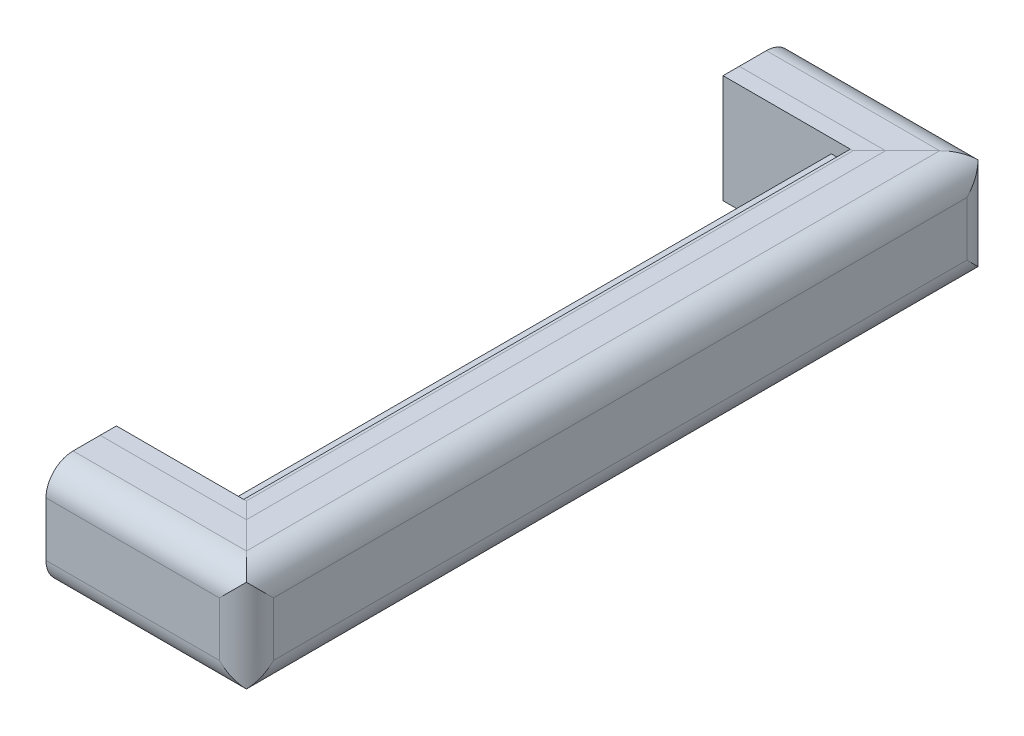
ISO-10303-21;
HEADER;
FILE_DESCRIPTION(('STEP AP214'),'2;1');
FILE_NAME('part.step','',(''),(''),'','','');
FILE_SCHEMA(('AUTOMOTIVE_DESIGN { 1 0 10303 214 1 1 1 1 }'));
ENDSEC;
DATA;
#1=APPLICATION_CONTEXT('core data for automotive mechanical design processes');
#2=APPLICATION_PROTOCOL_DEFINITION('international standard','automotive_design',2000,#1);
#3=PRODUCT_CONTEXT('',#1,'mechanical');
#4=PRODUCT('Part','Part','',(#3));
#5=PRODUCT_RELATED_PRODUCT_CATEGORY('part','',(#4));
#6=PRODUCT_DEFINITION_FORMATION('','',#4);
#7=PRODUCT_DEFINITION_CONTEXT('part definition',#1,'design');
#8=PRODUCT_DEFINITION('design','',#6,#7);
#9=PRODUCT_DEFINITION_SHAPE('','',#8);
#10=(LENGTH_UNIT() NAMED_UNIT(*) SI_UNIT(.MILLI.,.METRE.));
#11=(NAMED_UNIT(*) PLANE_ANGLE_UNIT() SI_UNIT($,.RADIAN.));
#12=(NAMED_UNIT(*) SI_UNIT($,.STERADIAN.) SOLID_ANGLE_UNIT());
#13=UNCERTAINTY_MEASURE_WITH_UNIT(LENGTH_MEASURE(1.E-05),#10,'distance_accuracy_value','');
#14=(GEOMETRIC_REPRESENTATION_CONTEXT(3) GLOBAL_UNCERTAINTY_ASSIGNED_CONTEXT((#13)) GLOBAL_UNIT_ASSIGNED_CONTEXT((#10,
#11,#12)) REPRESENTATION_CONTEXT('',''));
#15=CARTESIAN_POINT('',(0.,0.,0.));
#16=DIRECTION('',(0.,0.,1.));
#17=DIRECTION('',(1.,0.,0.));
#18=AXIS2_PLACEMENT_3D('',#15,#16,#17);
#19=CARTESIAN_POINT('',(149.225,0.,-387.35));
#20=DIRECTION('',(-1.,0.,0.));
#21=DIRECTION('',(0.,0.,1.));
#22=AXIS2_PLACEMENT_3D('',#19,#20,#21);
#23=PLANE('',#22);
#24=DIRECTION('',(0.,1.,0.));
#25=VECTOR('',#24,1.);
#26=CARTESIAN_POINT('',(149.225,0.,-355.6));
#27=LINE('',#26,#25);
#28=CARTESIAN_POINT('',(149.225,47.625,-355.6));
#29=VERTEX_POINT('',#28);
#30=CARTESIAN_POINT('',(149.225,63.5,-355.6));
#31=VERTEX_POINT('',#30);
#32=EDGE_CURVE('E55',#29,#31,#27,.T.);
#33=ORIENTED_EDGE('',*,*,#32,.F.);
#34=DIRECTION('',(0.,0.,1.));
#35=VECTOR('',#34,1.);
#36=CARTESIAN_POINT('',(149.225,47.625,-387.35));
#37=LINE('',#36,#35);
#38=CARTESIAN_POINT('',(149.225,47.625,355.6));
#39=VERTEX_POINT('',#38);
#40=EDGE_CURVE('E121',#29,#39,#37,.T.);
#41=ORIENTED_EDGE('',*,*,#40,.T.);
#42=DIRECTION('',(0.,-1.,0.));
#43=VECTOR('',#42,1.);
#44=CARTESIAN_POINT('',(149.225,0.,355.6));
#45=LINE('',#44,#43);
#46=CARTESIAN_POINT('',(149.225,63.5,355.6));
#47=VERTEX_POINT('',#46);
#48=EDGE_CURVE('E114',#47,#39,#45,.T.);
#49=ORIENTED_EDGE('',*,*,#48,.F.);
#50=DIRECTION('',(0.,0.,1.));
#51=VECTOR('',#50,1.);
#52=CARTESIAN_POINT('',(149.225,63.5,-387.35));
#53=LINE('',#52,#51);
#54=EDGE_CURVE('E98',#31,#47,#53,.T.);
#55=ORIENTED_EDGE('',*,*,#54,.F.);
#56=EDGE_LOOP('',(#33,#41,#49,#55));
#57=FACE_BOUND('',#56,.T.);
#58=ADVANCED_FACE('F48',(#57),#23,.T.);
#59=CARTESIAN_POINT('',(0.,63.5,-387.35));
#60=DIRECTION('',(0.,-1.,0.));
#61=DIRECTION('',(0.,0.,-1.));
#62=AXIS2_PLACEMENT_3D('',#59,#60,#61);
#63=PLANE('',#62);
#64=DIRECTION('',(0.,0.,1.));
#65=VECTOR('',#64,1.);
#66=CARTESIAN_POINT('',(152.4,63.5,-387.35));
#67=LINE('',#66,#65);
#68=CARTESIAN_POINT('',(152.4,63.5,-355.6));
#69=VERTEX_POINT('',#68);
#70=CARTESIAN_POINT('',(152.4,63.5,355.6));
#71=VERTEX_POINT('',#70);
#72=EDGE_CURVE('E109',#69,#71,#67,.T.);
#73=ORIENTED_EDGE('',*,*,#72,.F.);
#74=DIRECTION('',(-1.,0.,0.));
#75=VECTOR('',#74,1.);
#76=CARTESIAN_POINT('',(0.,63.5,-355.6));
#77=LINE('',#76,#75);
#78=EDGE_CURVE('E104',#69,#31,#77,.T.);
#79=ORIENTED_EDGE('',*,*,#78,.T.);
#80=ORIENTED_EDGE('',*,*,#54,.T.);
#81=DIRECTION('',(1.,0.,0.));
#82=VECTOR('',#81,1.);
#83=CARTESIAN_POINT('',(0.,63.5,355.6));
#84=LINE('',#83,#82);
#85=EDGE_CURVE('E102',#47,#71,#84,.T.);
#86=ORIENTED_EDGE('',*,*,#85,.T.);
#87=EDGE_LOOP('',(#73,#79,#80,#86));
#88=FACE_BOUND('',#87,.T.);
#89=ADVANCED_FACE('F101',(#88),#63,.F.);
#90=CARTESIAN_POINT('',(152.4,0.,-387.35));
#91=DIRECTION('',(-1.,0.,0.));
#92=DIRECTION('',(0.,0.,1.));
#93=AXIS2_PLACEMENT_3D('',#90,#91,#92);
#94=PLANE('',#93);
#95=DIRECTION('',(0.,0.,1.));
#96=VECTOR('',#95,1.);
#97=CARTESIAN_POINT('',(152.4,44.45,-387.35));
#98=LINE('',#97,#96);
#99=CARTESIAN_POINT('',(152.4,44.45,-355.6));
#100=VERTEX_POINT('',#99);
#101=CARTESIAN_POINT('',(152.4,44.45,355.6));
#102=VERTEX_POINT('',#101);
#103=EDGE_CURVE('E140',#100,#102,#98,.T.);
#104=ORIENTED_EDGE('',*,*,#103,.F.);
#105=DIRECTION('',(0.,1.,0.));
#106=VECTOR('',#105,1.);
#107=CARTESIAN_POINT('',(152.4,0.,-355.6));
#108=LINE('',#107,#106);
#109=EDGE_CURVE('E67',#100,#69,#108,.T.);
#110=ORIENTED_EDGE('',*,*,#109,.T.);
#111=ORIENTED_EDGE('',*,*,#72,.T.);
#112=DIRECTION('',(0.,-1.,0.));
#113=VECTOR('',#112,1.);
#114=CARTESIAN_POINT('',(152.4,0.,355.6));
#115=LINE('',#114,#113);
#116=EDGE_CURVE('E118',#71,#102,#115,.T.);
#117=ORIENTED_EDGE('',*,*,#116,.T.);
#118=EDGE_LOOP('',(#104,#110,#111,#117));
#119=FACE_BOUND('',#118,.T.);
#120=ADVANCED_FACE('F144',(#119),#94,.F.);
#121=CARTESIAN_POINT('',(0.,44.45,-387.35));
#122=DIRECTION('',(0.,1.,0.));
#123=DIRECTION('',(0.,0.,1.));
#124=AXIS2_PLACEMENT_3D('',#121,#122,#123);
#125=PLANE('',#124);
#126=DIRECTION('',(0.,0.,1.));
#127=VECTOR('',#126,1.);
#128=CARTESIAN_POINT('',(127.,44.45,-387.35));
#129=LINE('',#128,#127);
#130=CARTESIAN_POINT('',(127.,44.45,-355.6));
#131=VERTEX_POINT('',#130);
#132=CARTESIAN_POINT('',(127.,44.45,355.6));
#133=VERTEX_POINT('',#132);
#134=EDGE_CURVE('E138',#131,#133,#129,.T.);
#135=ORIENTED_EDGE('',*,*,#134,.F.);
#136=DIRECTION('',(1.,0.,0.));
#137=VECTOR('',#136,1.);
#138=CARTESIAN_POINT('',(0.,44.45,-355.6));
#139=LINE('',#138,#137);
#140=EDGE_CURVE('E62',#131,#100,#139,.T.);
#141=ORIENTED_EDGE('',*,*,#140,.T.);
#142=ORIENTED_EDGE('',*,*,#103,.T.);
#143=DIRECTION('',(-1.,0.,0.));
#144=VECTOR('',#143,1.);
#145=CARTESIAN_POINT('',(0.,44.45,355.6));
#146=LINE('',#145,#144);
#147=EDGE_CURVE('E127',#102,#133,#146,.T.);
#148=ORIENTED_EDGE('',*,*,#147,.T.);
#149=EDGE_LOOP('',(#135,#141,#142,#148));
#150=FACE_BOUND('',#149,.T.);
#151=ADVANCED_FACE('F158',(#150),#125,.F.);
#152=CARTESIAN_POINT('',(127.,0.,-387.35));
#153=DIRECTION('',(-1.,0.,0.));
#154=DIRECTION('',(0.,0.,1.));
#155=AXIS2_PLACEMENT_3D('',#152,#153,#154);
#156=PLANE('',#155);
#157=DIRECTION('',(0.,1.,0.));
#158=VECTOR('',#157,1.);
#159=CARTESIAN_POINT('',(127.,0.,-355.6));
#160=LINE('',#159,#158);
#161=CARTESIAN_POINT('',(127.,47.625,-355.6));
#162=VERTEX_POINT('',#161);
#163=EDGE_CURVE('E108',#131,#162,#160,.T.);
#164=ORIENTED_EDGE('',*,*,#163,.F.);
#165=ORIENTED_EDGE('',*,*,#134,.T.);
#166=DIRECTION('',(0.,-1.,0.));
#167=VECTOR('',#166,1.);
#168=CARTESIAN_POINT('',(127.,0.,355.6));
#169=LINE('',#168,#167);
#170=CARTESIAN_POINT('',(127.,47.625,355.6));
#171=VERTEX_POINT('',#170);
#172=EDGE_CURVE('E130',#171,#133,#169,.T.);
#173=ORIENTED_EDGE('',*,*,#172,.F.);
#174=DIRECTION('',(0.,0.,1.));
#175=VECTOR('',#174,1.);
#176=CARTESIAN_POINT('',(127.,47.625,-387.35));
#177=LINE('',#176,#175);
#178=EDGE_CURVE('E136',#162,#171,#177,.T.);
#179=ORIENTED_EDGE('',*,*,#178,.F.);
#180=EDGE_LOOP('',(#164,#165,#173,#179));
#181=FACE_BOUND('',#180,.T.);
#182=ADVANCED_FACE('F154',(#181),#156,.T.);
#183=CARTESIAN_POINT('',(0.,47.625,-387.35));
#184=DIRECTION('',(0.,1.,0.));
#185=DIRECTION('',(-1.,0.,0.));
#186=AXIS2_PLACEMENT_3D('',#183,#184,#185);
#187=PLANE('',#186);
#188=DIRECTION('',(1.,0.,0.));
#189=VECTOR('',#188,1.);
#190=CARTESIAN_POINT('',(0.,47.625,-355.6));
#191=LINE('',#190,#189);
#192=EDGE_CURVE('E12',#162,#29,#191,.T.);
#193=ORIENTED_EDGE('',*,*,#192,.F.);
#194=ORIENTED_EDGE('',*,*,#178,.T.);
#195=DIRECTION('',(-1.,0.,0.));
#196=VECTOR('',#195,1.);
#197=CARTESIAN_POINT('',(0.,47.625,355.6));
#198=LINE('',#197,#196);
#199=EDGE_CURVE('E133',#39,#171,#198,.T.);
#200=ORIENTED_EDGE('',*,*,#199,.F.);
#201=ORIENTED_EDGE('',*,*,#40,.F.);
#202=EDGE_LOOP('',(#193,#194,#200,#201));
#203=FACE_BOUND('',#202,.T.);
#204=ADVANCED_FACE('F156',(#203),#187,.T.);
#205=CARTESIAN_POINT('',(0.,0.,355.6));
#206=DIRECTION('',(0.,0.,-1.));
#207=DIRECTION('',(-1.,0.,0.));
#208=AXIS2_PLACEMENT_3D('',#205,#206,#207);
#209=PLANE('',#208);
#210=ORIENTED_EDGE('',*,*,#48,.T.);
#211=ORIENTED_EDGE('',*,*,#199,.T.);
#212=ORIENTED_EDGE('',*,*,#172,.T.);
#213=ORIENTED_EDGE('',*,*,#147,.F.);
#214=ORIENTED_EDGE('',*,*,#116,.F.);
#215=ORIENTED_EDGE('',*,*,#85,.F.);
#216=EDGE_LOOP('',(#210,#211,#212,#213,#214,#215));
#217=FACE_BOUND('',#216,.T.);
#218=ADVANCED_FACE('F112',(#217),#209,.F.);
#219=CARTESIAN_POINT('',(243.305,63.5,-355.6));
#220=DIRECTION('',(0.,0.,1.));
#221=DIRECTION('',(1.,0.,0.));
#222=AXIS2_PLACEMENT_3D('',#219,#220,#221);
#223=PLANE('',#222);
#224=ORIENTED_EDGE('',*,*,#32,.T.);
#225=ORIENTED_EDGE('',*,*,#78,.F.);
#226=ORIENTED_EDGE('',*,*,#109,.F.);
#227=ORIENTED_EDGE('',*,*,#140,.F.);
#228=ORIENTED_EDGE('',*,*,#163,.T.);
#229=ORIENTED_EDGE('',*,*,#192,.T.);
#230=EDGE_LOOP('',(#224,#225,#226,#227,#228,#229));
#231=FACE_BOUND('',#230,.T.);
#232=ADVANCED_FACE('F149',(#231),#223,.F.);
#233=CLOSED_SHELL('',(#58,#89,#120,#151,#182,#204,#218,#232));
#234=MANIFOLD_SOLID_BREP('B2',#233);
#235=CARTESIAN_POINT('',(243.305,31.75,-406.4));
#236=DIRECTION('',(-1.,0.,0.));
#237=DIRECTION('',(0.,0.,1.));
#238=AXIS2_PLACEMENT_3D('',#235,#236,#237);
#239=CYLINDRICAL_SURFACE('',#238,31.75);
#240=CARTESIAN_POINT('',(203.2,31.75,-406.4));
#241=DIRECTION('',(-0.707106781186547,0.,-0.707106781186547));
#242=DIRECTION('',(0.707106781186548,0.,-0.707106781186548));
#243=AXIS2_PLACEMENT_3D('',#240,#241,#242);
#244=ELLIPSE('',#243,44.9012806053458,31.75);
#245=CARTESIAN_POINT('',(225.650640302673,54.2006403026728,-428.850640302673));
#246=VERTEX_POINT('',#245);
#247=CARTESIAN_POINT('',(203.2,63.5,-406.4));
#248=VERTEX_POINT('',#247);
#249=EDGE_CURVE('E428',#246,#248,#244,.F.);
#250=ORIENTED_EDGE('',*,*,#249,.F.);
#251=CARTESIAN_POINT('',(203.2,31.75,-406.4));
#252=DIRECTION('',(-0.707106781186547,0.707106781186547,0.));
#253=DIRECTION('',(-0.707106781186547,-0.707106781186547,0.));
#254=AXIS2_PLACEMENT_3D('',#251,#252,#253);
#255=ELLIPSE('',#254,44.9012806053458,31.75);
#256=CARTESIAN_POINT('',(203.2,31.75,-438.15));
#257=VERTEX_POINT('',#256);
#258=EDGE_CURVE('E253',#246,#257,#255,.T.);
#259=ORIENTED_EDGE('',*,*,#258,.T.);
#260=DIRECTION('',(-1.,0.,0.));
#261=VECTOR('',#260,1.);
#262=CARTESIAN_POINT('',(243.305,31.75,-438.15));
#263=LINE('',#262,#261);
#264=CARTESIAN_POINT('',(0.,31.75,-438.15));
#265=VERTEX_POINT('',#264);
#266=EDGE_CURVE('E494',#257,#265,#263,.T.);
#267=ORIENTED_EDGE('',*,*,#266,.T.);
#268=CARTESIAN_POINT('',(0.,31.75,-406.4));
#269=DIRECTION('',(-1.,0.,0.));
#270=DIRECTION('',(0.,0.,1.));
#271=AXIS2_PLACEMENT_3D('',#268,#269,#270);
#272=CIRCLE('',#271,31.75);
#273=CARTESIAN_POINT('',(0.,63.5,-406.4));
#274=VERTEX_POINT('',#273);
#275=EDGE_CURVE('E477',#274,#265,#272,.T.);
#276=ORIENTED_EDGE('',*,*,#275,.F.);
#277=DIRECTION('',(-1.,0.,0.));
#278=VECTOR('',#277,1.);
#279=CARTESIAN_POINT('',(243.305,63.5,-406.4));
#280=LINE('',#279,#278);
#281=EDGE_CURVE('E496',#248,#274,#280,.T.);
#282=ORIENTED_EDGE('',*,*,#281,.F.);
#283=EDGE_LOOP('',(#250,#259,#267,#276,#282));
#284=FACE_BOUND('',#283,.T.);
#285=ADVANCED_FACE('F238',(#284),#239,.T.);
#286=CARTESIAN_POINT('',(243.305,-31.75,-406.4));
#287=DIRECTION('',(-1.,0.,0.));
#288=DIRECTION('',(0.,0.,1.));
#289=AXIS2_PLACEMENT_3D('',#286,#287,#288);
#290=CYLINDRICAL_SURFACE('',#289,31.75);
#291=DIRECTION('',(-1.,0.,0.));
#292=VECTOR('',#291,1.);
#293=CARTESIAN_POINT('',(243.305,-31.75,-438.15));
#294=LINE('',#293,#292);
#295=CARTESIAN_POINT('',(203.2,-31.75,-438.15));
#296=VERTEX_POINT('',#295);
#297=CARTESIAN_POINT('',(0.,-31.75,-438.15));
#298=VERTEX_POINT('',#297);
#299=EDGE_CURVE('E492',#296,#298,#294,.T.);
#300=ORIENTED_EDGE('',*,*,#299,.F.);
#301=CARTESIAN_POINT('',(203.2,-31.75,-406.4));
#302=DIRECTION('',(-0.707106781186547,-0.707106781186547,0.));
#303=DIRECTION('',(-0.707106781186547,0.707106781186547,0.));
#304=AXIS2_PLACEMENT_3D('',#301,#302,#303);
#305=ELLIPSE('',#304,44.9012806053458,31.75);
#306=CARTESIAN_POINT('',(225.650640302673,-54.2006403026728,-428.850640302673));
#307=VERTEX_POINT('',#306);
#308=EDGE_CURVE('E470',#296,#307,#305,.T.);
#309=ORIENTED_EDGE('',*,*,#308,.T.);
#310=CARTESIAN_POINT('',(203.2,-31.75,-406.4));
#311=DIRECTION('',(-0.707106781186547,0.,-0.707106781186547));
#312=DIRECTION('',(0.707106781186548,0.,-0.707106781186548));
#313=AXIS2_PLACEMENT_3D('',#310,#311,#312);
#314=ELLIPSE('',#313,44.9012806053458,31.75);
#315=CARTESIAN_POINT('',(203.2,-63.5,-406.4));
#316=VERTEX_POINT('',#315);
#317=EDGE_CURVE('E430',#316,#307,#314,.F.);
#318=ORIENTED_EDGE('',*,*,#317,.F.);
#319=DIRECTION('',(-1.,0.,0.));
#320=VECTOR('',#319,1.);
#321=CARTESIAN_POINT('',(243.305,-63.5,-406.4));
#322=LINE('',#321,#320);
#323=CARTESIAN_POINT('',(0.,-63.5,-406.4));
#324=VERTEX_POINT('',#323);
#325=EDGE_CURVE('E489',#316,#324,#322,.T.);
#326=ORIENTED_EDGE('',*,*,#325,.T.);
#327=CARTESIAN_POINT('',(0.,-31.75,-406.4));
#328=DIRECTION('',(-1.,0.,0.));
#329=DIRECTION('',(0.,0.,1.));
#330=AXIS2_PLACEMENT_3D('',#327,#328,#329);
#331=CIRCLE('',#330,31.75);
#332=EDGE_CURVE('E472',#298,#324,#331,.T.);
#333=ORIENTED_EDGE('',*,*,#332,.F.);
#334=EDGE_LOOP('',(#300,#309,#318,#326,#333));
#335=FACE_BOUND('',#334,.T.);
#336=ADVANCED_FACE('F614',(#335),#290,.T.);
#337=CARTESIAN_POINT('',(203.2,-31.75,446.505));
#338=DIRECTION('',(0.,0.,-1.));
#339=DIRECTION('',(-1.,0.,0.));
#340=AXIS2_PLACEMENT_3D('',#337,#338,#339);
#341=CYLINDRICAL_SURFACE('',#340,31.75);
#342=DIRECTION('',(0.,0.,-1.));
#343=VECTOR('',#342,1.);
#344=CARTESIAN_POINT('',(234.95,-31.75,446.505));
#345=LINE('',#344,#343);
#346=CARTESIAN_POINT('',(234.95,-31.75,406.4));
#347=VERTEX_POINT('',#346);
#348=CARTESIAN_POINT('',(234.95,-31.75,-406.4));
#349=VERTEX_POINT('',#348);
#350=EDGE_CURVE('E447',#347,#349,#345,.T.);
#351=ORIENTED_EDGE('',*,*,#350,.F.);
#352=CARTESIAN_POINT('',(203.2,-31.75,406.4));
#353=DIRECTION('',(0.,-0.707106781186548,-0.707106781186547));
#354=DIRECTION('',(0.,0.707106781186548,-0.707106781186547));
#355=AXIS2_PLACEMENT_3D('',#352,#353,#354);
#356=ELLIPSE('',#355,44.9012806053458,31.75);
#357=CARTESIAN_POINT('',(225.650640302673,-54.2006403026729,428.850640302673));
#358=VERTEX_POINT('',#357);
#359=EDGE_CURVE('E392',#347,#358,#356,.T.);
#360=ORIENTED_EDGE('',*,*,#359,.T.);
#361=CARTESIAN_POINT('',(203.2,-31.75,406.4));
#362=DIRECTION('',(0.707106781186547,0.,-0.707106781186547));
#363=DIRECTION('',(0.707106781186548,0.,0.707106781186548));
#364=AXIS2_PLACEMENT_3D('',#361,#362,#363);
#365=ELLIPSE('',#364,44.9012806053458,31.75);
#366=CARTESIAN_POINT('',(203.2,-63.5,406.4));
#367=VERTEX_POINT('',#366);
#368=EDGE_CURVE('E391',#367,#358,#365,.F.);
#369=ORIENTED_EDGE('',*,*,#368,.F.);
#370=DIRECTION('',(0.,0.,-1.));
#371=VECTOR('',#370,1.);
#372=CARTESIAN_POINT('',(203.2,-63.5,446.505));
#373=LINE('',#372,#371);
#374=EDGE_CURVE('E443',#367,#316,#373,.T.);
#375=ORIENTED_EDGE('',*,*,#374,.T.);
#376=ORIENTED_EDGE('',*,*,#317,.T.);
#377=CARTESIAN_POINT('',(203.2,-31.75,-406.4));
#378=DIRECTION('',(0.,0.707106781186548,-0.707106781186547));
#379=DIRECTION('',(0.,-0.707106781186548,-0.707106781186547));
#380=AXIS2_PLACEMENT_3D('',#377,#378,#379);
#381=ELLIPSE('',#380,44.9012806053458,31.75);
#382=EDGE_CURVE('E625',#307,#349,#381,.F.);
#383=ORIENTED_EDGE('',*,*,#382,.T.);
#384=EDGE_LOOP('',(#351,#360,#369,#375,#376,#383));
#385=FACE_BOUND('',#384,.T.);
#386=ADVANCED_FACE('F621',(#385),#341,.T.);
#387=CARTESIAN_POINT('',(234.95,31.75,446.505));
#388=DIRECTION('',(1.,0.,0.));
#389=DIRECTION('',(0.,0.,-1.));
#390=AXIS2_PLACEMENT_3D('',#387,#388,#389);
#391=PLANE('',#390);
#392=DIRECTION('',(0.,1.,0.));
#393=VECTOR('',#392,1.);
#394=CARTESIAN_POINT('',(234.95,-63.5,406.4));
#395=LINE('',#394,#393);
#396=CARTESIAN_POINT('',(234.95,31.75,406.4));
#397=VERTEX_POINT('',#396);
#398=EDGE_CURVE('E381',#347,#397,#395,.T.);
#399=ORIENTED_EDGE('',*,*,#398,.F.);
#400=ORIENTED_EDGE('',*,*,#350,.T.);
#401=DIRECTION('',(0.,1.,0.));
#402=VECTOR('',#401,1.);
#403=CARTESIAN_POINT('',(234.95,-63.5,-406.4));
#404=LINE('',#403,#402);
#405=CARTESIAN_POINT('',(234.95,31.75,-406.4));
#406=VERTEX_POINT('',#405);
#407=EDGE_CURVE('E632',#349,#406,#404,.T.);
#408=ORIENTED_EDGE('',*,*,#407,.T.);
#409=DIRECTION('',(0.,0.,-1.));
#410=VECTOR('',#409,1.);
#411=CARTESIAN_POINT('',(234.95,31.75,446.505));
#412=LINE('',#411,#410);
#413=EDGE_CURVE('E450',#397,#406,#412,.T.);
#414=ORIENTED_EDGE('',*,*,#413,.F.);
#415=EDGE_LOOP('',(#399,#400,#408,#414));
#416=FACE_BOUND('',#415,.T.);
#417=ADVANCED_FACE('F630',(#416),#391,.T.);
#418=CARTESIAN_POINT('',(203.2,31.75,446.505));
#419=DIRECTION('',(0.,0.,-1.));
#420=DIRECTION('',(-1.,0.,0.));
#421=AXIS2_PLACEMENT_3D('',#418,#419,#420);
#422=CYLINDRICAL_SURFACE('',#421,31.75);
#423=CARTESIAN_POINT('',(203.2,31.75,406.4));
#424=DIRECTION('',(0.707106781186547,0.,-0.707106781186547));
#425=DIRECTION('',(0.707106781186548,0.,0.707106781186548));
#426=AXIS2_PLACEMENT_3D('',#423,#424,#425);
#427=ELLIPSE('',#426,44.9012806053458,31.75);
#428=CARTESIAN_POINT('',(225.650640302673,54.2006403026729,428.850640302673));
#429=VERTEX_POINT('',#428);
#430=CARTESIAN_POINT('',(203.2,63.5,406.4));
#431=VERTEX_POINT('',#430);
#432=EDGE_CURVE('E517',#429,#431,#427,.F.);
#433=ORIENTED_EDGE('',*,*,#432,.F.);
#434=CARTESIAN_POINT('',(203.2,31.75,406.4));
#435=DIRECTION('',(0.,0.707106781186548,-0.707106781186547));
#436=DIRECTION('',(0.,-0.707106781186548,-0.707106781186547));
#437=AXIS2_PLACEMENT_3D('',#434,#435,#436);
#438=ELLIPSE('',#437,44.9012806053458,31.75);
#439=EDGE_CURVE('E260',#429,#397,#438,.T.);
#440=ORIENTED_EDGE('',*,*,#439,.T.);
#441=ORIENTED_EDGE('',*,*,#413,.T.);
#442=CARTESIAN_POINT('',(203.2,31.75,-406.4));
#443=DIRECTION('',(0.,-0.707106781186548,-0.707106781186547));
#444=DIRECTION('',(0.,0.707106781186548,-0.707106781186547));
#445=AXIS2_PLACEMENT_3D('',#442,#443,#444);
#446=ELLIPSE('',#445,44.9012806053458,31.75);
#447=EDGE_CURVE('E46',#406,#246,#446,.F.);
#448=ORIENTED_EDGE('',*,*,#447,.T.);
#449=ORIENTED_EDGE('',*,*,#249,.T.);
#450=DIRECTION('',(0.,0.,-1.));
#451=VECTOR('',#450,1.);
#452=CARTESIAN_POINT('',(203.2,63.5,446.505));
#453=LINE('',#452,#451);
#454=EDGE_CURVE('E453',#431,#248,#453,.T.);
#455=ORIENTED_EDGE('',*,*,#454,.F.);
#456=EDGE_LOOP('',(#433,#440,#441,#448,#449,#455));
#457=FACE_BOUND('',#456,.T.);
#458=ADVANCED_FACE('F600',(#457),#422,.T.);
#459=CARTESIAN_POINT('',(0.,-31.75,406.4));
#460=DIRECTION('',(1.,0.,0.));
#461=DIRECTION('',(0.,0.,-1.));
#462=AXIS2_PLACEMENT_3D('',#459,#460,#461);
#463=CYLINDRICAL_SURFACE('',#462,31.75);
#464=ORIENTED_EDGE('',*,*,#368,.T.);
#465=CARTESIAN_POINT('',(203.2,-31.75,406.4));
#466=DIRECTION('',(0.707106781186547,0.707106781186547,0.));
#467=DIRECTION('',(0.707106781186547,-0.707106781186547,0.));
#468=AXIS2_PLACEMENT_3D('',#465,#466,#467);
#469=ELLIPSE('',#468,44.9012806053458,31.75);
#470=CARTESIAN_POINT('',(203.2,-31.75,438.15));
#471=VERTEX_POINT('',#470);
#472=EDGE_CURVE('E375',#358,#471,#469,.F.);
#473=ORIENTED_EDGE('',*,*,#472,.T.);
#474=DIRECTION('',(1.,0.,0.));
#475=VECTOR('',#474,1.);
#476=CARTESIAN_POINT('',(0.,-31.75,438.15));
#477=LINE('',#476,#475);
#478=CARTESIAN_POINT('',(0.,-31.75,438.15));
#479=VERTEX_POINT('',#478);
#480=EDGE_CURVE('E389',#479,#471,#477,.T.);
#481=ORIENTED_EDGE('',*,*,#480,.F.);
#482=CARTESIAN_POINT('',(0.,-31.75,406.4));
#483=DIRECTION('',(1.,0.,0.));
#484=DIRECTION('',(0.,0.,-1.));
#485=AXIS2_PLACEMENT_3D('',#482,#483,#484);
#486=CIRCLE('',#485,31.75);
#487=CARTESIAN_POINT('',(0.,-63.5,406.4));
#488=VERTEX_POINT('',#487);
#489=EDGE_CURVE('E406',#479,#488,#486,.T.);
#490=ORIENTED_EDGE('',*,*,#489,.T.);
#491=DIRECTION('',(1.,0.,0.));
#492=VECTOR('',#491,1.);
#493=CARTESIAN_POINT('',(0.,-63.5,406.4));
#494=LINE('',#493,#492);
#495=EDGE_CURVE('E397',#488,#367,#494,.T.);
#496=ORIENTED_EDGE('',*,*,#495,.T.);
#497=EDGE_LOOP('',(#464,#473,#481,#490,#496));
#498=FACE_BOUND('',#497,.T.);
#499=ADVANCED_FACE('F387',(#498),#463,.T.);
#500=CARTESIAN_POINT('',(0.,31.75,438.15));
#501=DIRECTION('',(0.,0.,1.));
#502=DIRECTION('',(1.,0.,0.));
#503=AXIS2_PLACEMENT_3D('',#500,#501,#502);
#504=PLANE('',#503);
#505=ORIENTED_EDGE('',*,*,#480,.T.);
#506=DIRECTION('',(0.,1.,0.));
#507=VECTOR('',#506,1.);
#508=CARTESIAN_POINT('',(203.2,-63.5,438.15));
#509=LINE('',#508,#507);
#510=CARTESIAN_POINT('',(203.2,31.75,438.15));
#511=VERTEX_POINT('',#510);
#512=EDGE_CURVE('E372',#471,#511,#509,.T.);
#513=ORIENTED_EDGE('',*,*,#512,.T.);
#514=DIRECTION('',(1.,0.,0.));
#515=VECTOR('',#514,1.);
#516=CARTESIAN_POINT('',(0.,31.75,438.15));
#517=LINE('',#516,#515);
#518=CARTESIAN_POINT('',(0.,31.75,438.15));
#519=VERTEX_POINT('',#518);
#520=EDGE_CURVE('E398',#519,#511,#517,.T.);
#521=ORIENTED_EDGE('',*,*,#520,.F.);
#522=DIRECTION('',(0.,-1.,0.));
#523=VECTOR('',#522,1.);
#524=CARTESIAN_POINT('',(0.,31.75,438.15));
#525=LINE('',#524,#523);
#526=EDGE_CURVE('E396',#519,#479,#525,.T.);
#527=ORIENTED_EDGE('',*,*,#526,.T.);
#528=EDGE_LOOP('',(#505,#513,#521,#527));
#529=FACE_BOUND('',#528,.T.);
#530=ADVANCED_FACE('F395',(#529),#504,.T.);
#531=CARTESIAN_POINT('',(0.,31.75,406.4));
#532=DIRECTION('',(1.,0.,0.));
#533=DIRECTION('',(0.,0.,-1.));
#534=AXIS2_PLACEMENT_3D('',#531,#532,#533);
#535=CYLINDRICAL_SURFACE('',#534,31.75);
#536=ORIENTED_EDGE('',*,*,#520,.T.);
#537=CARTESIAN_POINT('',(203.2,31.75,406.4));
#538=DIRECTION('',(0.707106781186547,-0.707106781186547,0.));
#539=DIRECTION('',(0.707106781186547,0.707106781186547,0.));
#540=AXIS2_PLACEMENT_3D('',#537,#538,#539);
#541=ELLIPSE('',#540,44.9012806053458,31.75);
#542=EDGE_CURVE('E246',#511,#429,#541,.F.);
#543=ORIENTED_EDGE('',*,*,#542,.T.);
#544=ORIENTED_EDGE('',*,*,#432,.T.);
#545=DIRECTION('',(1.,0.,0.));
#546=VECTOR('',#545,1.);
#547=CARTESIAN_POINT('',(0.,63.5,406.4));
#548=LINE('',#547,#546);
#549=CARTESIAN_POINT('',(0.,63.5,406.4));
#550=VERTEX_POINT('',#549);
#551=EDGE_CURVE('E402',#550,#431,#548,.T.);
#552=ORIENTED_EDGE('',*,*,#551,.F.);
#553=CARTESIAN_POINT('',(0.,31.75,406.4));
#554=DIRECTION('',(1.,0.,0.));
#555=DIRECTION('',(0.,0.,-1.));
#556=AXIS2_PLACEMENT_3D('',#553,#554,#555);
#557=CIRCLE('',#556,31.75);
#558=EDGE_CURVE('E543',#550,#519,#557,.T.);
#559=ORIENTED_EDGE('',*,*,#558,.T.);
#560=EDGE_LOOP('',(#536,#543,#544,#552,#559));
#561=FACE_BOUND('',#560,.T.);
#562=ADVANCED_FACE('F548',(#561),#535,.T.);
#563=CARTESIAN_POINT('',(0.,31.75,-406.4));
#564=DIRECTION('',(-1.,0.,0.));
#565=DIRECTION('',(0.,0.,1.));
#566=AXIS2_PLACEMENT_3D('',#563,#564,#565);
#567=PLANE('',#566);
#568=DIRECTION('',(0.,0.,-1.));
#569=VECTOR('',#568,1.);
#570=CARTESIAN_POINT('',(0.,63.5,-374.65));
#571=LINE('',#570,#569);
#572=CARTESIAN_POINT('',(0.,63.5,-374.65));
#573=VERTEX_POINT('',#572);
#574=EDGE_CURVE('E480',#573,#274,#571,.T.);
#575=ORIENTED_EDGE('',*,*,#574,.T.);
#576=ORIENTED_EDGE('',*,*,#275,.T.);
#577=DIRECTION('',(0.,-1.,0.));
#578=VECTOR('',#577,1.);
#579=CARTESIAN_POINT('',(0.,31.75,-438.15));
#580=LINE('',#579,#578);
#581=EDGE_CURVE('E474',#265,#298,#580,.T.);
#582=ORIENTED_EDGE('',*,*,#581,.T.);
#583=ORIENTED_EDGE('',*,*,#332,.T.);
#584=DIRECTION('',(0.,0.,1.));
#585=VECTOR('',#584,1.);
#586=CARTESIAN_POINT('',(0.,-63.5,-406.4));
#587=LINE('',#586,#585);
#588=CARTESIAN_POINT('',(0.,-63.5,-374.65));
#589=VERTEX_POINT('',#588);
#590=EDGE_CURVE('E469',#324,#589,#587,.T.);
#591=ORIENTED_EDGE('',*,*,#590,.T.);
#592=DIRECTION('',(0.,0.,1.));
#593=VECTOR('',#592,1.);
#594=CARTESIAN_POINT('',(0.,-63.5,-374.65));
#595=LINE('',#594,#593);
#596=CARTESIAN_POINT('',(0.,-63.5,-355.6));
#597=VERTEX_POINT('',#596);
#598=EDGE_CURVE('E467',#589,#597,#595,.T.);
#599=ORIENTED_EDGE('',*,*,#598,.T.);
#600=DIRECTION('',(0.,1.,0.));
#601=VECTOR('',#600,1.);
#602=CARTESIAN_POINT('',(0.,63.5,-355.6));
#603=LINE('',#602,#601);
#604=CARTESIAN_POINT('',(0.,63.5,-355.6));
#605=VERTEX_POINT('',#604);
#606=EDGE_CURVE('E484',#597,#605,#603,.T.);
#607=ORIENTED_EDGE('',*,*,#606,.T.);
#608=DIRECTION('',(0.,0.,-1.));
#609=VECTOR('',#608,1.);
#610=CARTESIAN_POINT('',(0.,63.5,-374.65));
#611=LINE('',#610,#609);
#612=EDGE_CURVE('E482',#605,#573,#611,.T.);
#613=ORIENTED_EDGE('',*,*,#612,.T.);
#614=EDGE_LOOP('',(#575,#576,#582,#583,#591,#599,#607,#613));
#615=FACE_BOUND('',#614,.T.);
#616=ADVANCED_FACE('F240',(#615),#567,.T.);
#617=CARTESIAN_POINT('',(0.,31.75,406.4));
#618=DIRECTION('',(1.,0.,0.));
#619=DIRECTION('',(0.,0.,-1.));
#620=AXIS2_PLACEMENT_3D('',#617,#618,#619);
#621=PLANE('',#620);
#622=DIRECTION('',(0.,0.,1.));
#623=VECTOR('',#622,1.);
#624=CARTESIAN_POINT('',(0.,63.5,374.65));
#625=LINE('',#624,#623);
#626=CARTESIAN_POINT('',(0.,63.5,374.65));
#627=VERTEX_POINT('',#626);
#628=EDGE_CURVE('E539',#627,#550,#625,.T.);
#629=ORIENTED_EDGE('',*,*,#628,.F.);
#630=DIRECTION('',(0.,0.,1.));
#631=VECTOR('',#630,1.);
#632=CARTESIAN_POINT('',(0.,63.5,374.65));
#633=LINE('',#632,#631);
#634=CARTESIAN_POINT('',(0.,63.5,355.6));
#635=VERTEX_POINT('',#634);
#636=EDGE_CURVE('E531',#635,#627,#633,.T.);
#637=ORIENTED_EDGE('',*,*,#636,.F.);
#638=DIRECTION('',(0.,1.,0.));
#639=VECTOR('',#638,1.);
#640=CARTESIAN_POINT('',(0.,63.5,355.6));
#641=LINE('',#640,#639);
#642=CARTESIAN_POINT('',(0.,-63.5,355.6));
#643=VERTEX_POINT('',#642);
#644=EDGE_CURVE('E424',#643,#635,#641,.T.);
#645=ORIENTED_EDGE('',*,*,#644,.F.);
#646=DIRECTION('',(0.,0.,-1.));
#647=VECTOR('',#646,1.);
#648=CARTESIAN_POINT('',(0.,-63.5,374.65));
#649=LINE('',#648,#647);
#650=CARTESIAN_POINT('',(0.,-63.5,374.65));
#651=VERTEX_POINT('',#650);
#652=EDGE_CURVE('E411',#651,#643,#649,.T.);
#653=ORIENTED_EDGE('',*,*,#652,.F.);
#654=DIRECTION('',(0.,0.,-1.));
#655=VECTOR('',#654,1.);
#656=CARTESIAN_POINT('',(0.,-63.5,406.4));
#657=LINE('',#656,#655);
#658=EDGE_CURVE('E407',#488,#651,#657,.T.);
#659=ORIENTED_EDGE('',*,*,#658,.F.);
#660=ORIENTED_EDGE('',*,*,#489,.F.);
#661=ORIENTED_EDGE('',*,*,#526,.F.);
#662=ORIENTED_EDGE('',*,*,#558,.F.);
#663=EDGE_LOOP('',(#629,#637,#645,#653,#659,#660,#661,#662));
#664=FACE_BOUND('',#663,.T.);
#665=ADVANCED_FACE('F550',(#664),#621,.F.);
#666=CARTESIAN_POINT('',(243.305,63.5,-355.6));
#667=DIRECTION('',(0.,0.,1.));
#668=DIRECTION('',(1.,0.,0.));
#669=AXIS2_PLACEMENT_3D('',#666,#667,#668);
#670=PLANE('',#669);
#671=DIRECTION('',(0.,-1.,0.));
#672=VECTOR('',#671,1.);
#673=CARTESIAN_POINT('',(152.4,63.5,-355.6));
#674=LINE('',#673,#672);
#675=CARTESIAN_POINT('',(152.4,63.5,-355.6));
#676=VERTEX_POINT('',#675);
#677=CARTESIAN_POINT('',(152.4,-63.5,-355.6));
#678=VERTEX_POINT('',#677);
#679=EDGE_CURVE('E439',#676,#678,#674,.T.);
#680=ORIENTED_EDGE('',*,*,#679,.F.);
#681=DIRECTION('',(-1.,0.,0.));
#682=VECTOR('',#681,1.);
#683=CARTESIAN_POINT('',(243.305,63.5,-355.6));
#684=LINE('',#683,#682);
#685=EDGE_CURVE('E502',#676,#605,#684,.T.);
#686=ORIENTED_EDGE('',*,*,#685,.T.);
#687=ORIENTED_EDGE('',*,*,#606,.F.);
#688=DIRECTION('',(-1.,0.,0.));
#689=VECTOR('',#688,1.);
#690=CARTESIAN_POINT('',(243.305,-63.5,-355.6));
#691=LINE('',#690,#689);
#692=EDGE_CURVE('E444',#678,#597,#691,.T.);
#693=ORIENTED_EDGE('',*,*,#692,.F.);
#694=EDGE_LOOP('',(#680,#686,#687,#693));
#695=FACE_BOUND('',#694,.T.);
#696=ADVANCED_FACE('F579',(#695),#670,.T.);
#697=CARTESIAN_POINT('',(243.305,63.5,-374.65));
#698=DIRECTION('',(0.,1.,0.));
#699=DIRECTION('',(0.,0.,1.));
#700=AXIS2_PLACEMENT_3D('',#697,#698,#699);
#701=PLANE('',#700);
#702=DIRECTION('',(-0.707106781186547,0.,0.707106781186547));
#703=VECTOR('',#702,1.);
#704=CARTESIAN_POINT('',(-239.1275,63.5,35.9275));
#705=LINE('',#704,#703);
#706=CARTESIAN_POINT('',(171.45,63.5,-374.65));
#707=VERTEX_POINT('',#706);
#708=EDGE_CURVE('E421',#707,#676,#705,.T.);
#709=ORIENTED_EDGE('',*,*,#708,.F.);
#710=DIRECTION('',(-1.,0.,0.));
#711=VECTOR('',#710,1.);
#712=CARTESIAN_POINT('',(243.305,63.5,-374.65));
#713=LINE('',#712,#711);
#714=EDGE_CURVE('E499',#707,#573,#713,.T.);
#715=ORIENTED_EDGE('',*,*,#714,.T.);
#716=ORIENTED_EDGE('',*,*,#612,.F.);
#717=ORIENTED_EDGE('',*,*,#685,.F.);
#718=EDGE_LOOP('',(#709,#715,#716,#717));
#719=FACE_BOUND('',#718,.T.);
#720=ADVANCED_FACE('F589',(#719),#701,.T.);
#721=CARTESIAN_POINT('',(243.305,63.5,-374.65));
#722=DIRECTION('',(0.,1.,0.));
#723=DIRECTION('',(0.,0.,1.));
#724=AXIS2_PLACEMENT_3D('',#721,#722,#723);
#725=PLANE('',#724);
#726=DIRECTION('',(-0.707106781186547,0.,0.707106781186547));
#727=VECTOR('',#726,1.);
#728=CARTESIAN_POINT('',(-239.1275,63.5,35.9275));
#729=LINE('',#728,#727);
#730=EDGE_CURVE('E425',#248,#707,#729,.T.);
#731=ORIENTED_EDGE('',*,*,#730,.F.);
#732=ORIENTED_EDGE('',*,*,#281,.T.);
#733=ORIENTED_EDGE('',*,*,#574,.F.);
#734=ORIENTED_EDGE('',*,*,#714,.F.);
#735=EDGE_LOOP('',(#731,#732,#733,#734));
#736=FACE_BOUND('',#735,.T.);
#737=ADVANCED_FACE('F594',(#736),#725,.T.);
#738=CARTESIAN_POINT('',(243.305,31.75,-438.15));
#739=DIRECTION('',(0.,0.,-1.));
#740=DIRECTION('',(-1.,0.,0.));
#741=AXIS2_PLACEMENT_3D('',#738,#739,#740);
#742=PLANE('',#741);
#743=DIRECTION('',(0.,1.,0.));
#744=VECTOR('',#743,1.);
#745=CARTESIAN_POINT('',(203.2,-63.5,-438.15));
#746=LINE('',#745,#744);
#747=EDGE_CURVE('E382',#296,#257,#746,.T.);
#748=ORIENTED_EDGE('',*,*,#747,.F.);
#749=ORIENTED_EDGE('',*,*,#299,.T.);
#750=ORIENTED_EDGE('',*,*,#581,.F.);
#751=ORIENTED_EDGE('',*,*,#266,.F.);
#752=EDGE_LOOP('',(#748,#749,#750,#751));
#753=FACE_BOUND('',#752,.T.);
#754=ADVANCED_FACE('F610',(#753),#742,.T.);
#755=CARTESIAN_POINT('',(243.305,-63.5,-406.4));
#756=DIRECTION('',(0.,-1.,0.));
#757=DIRECTION('',(0.,0.,-1.));
#758=AXIS2_PLACEMENT_3D('',#755,#756,#757);
#759=PLANE('',#758);
#760=DIRECTION('',(0.707106781186547,0.,-0.707106781186547));
#761=VECTOR('',#760,1.);
#762=CARTESIAN_POINT('',(-223.2525,-63.5,20.0525));
#763=LINE('',#762,#761);
#764=CARTESIAN_POINT('',(171.45,-63.5,-374.65));
#765=VERTEX_POINT('',#764);
#766=EDGE_CURVE('E433',#765,#316,#763,.T.);
#767=ORIENTED_EDGE('',*,*,#766,.F.);
#768=DIRECTION('',(-1.,0.,0.));
#769=VECTOR('',#768,1.);
#770=CARTESIAN_POINT('',(243.305,-63.5,-374.65));
#771=LINE('',#770,#769);
#772=EDGE_CURVE('E486',#765,#589,#771,.T.);
#773=ORIENTED_EDGE('',*,*,#772,.T.);
#774=ORIENTED_EDGE('',*,*,#590,.F.);
#775=ORIENTED_EDGE('',*,*,#325,.F.);
#776=EDGE_LOOP('',(#767,#773,#774,#775));
#777=FACE_BOUND('',#776,.T.);
#778=ADVANCED_FACE('F618',(#777),#759,.T.);
#779=CARTESIAN_POINT('',(243.305,-63.5,-374.65));
#780=DIRECTION('',(0.,-1.,0.));
#781=DIRECTION('',(0.,0.,-1.));
#782=AXIS2_PLACEMENT_3D('',#779,#780,#781);
#783=PLANE('',#782);
#784=DIRECTION('',(0.707106781186547,0.,-0.707106781186547));
#785=VECTOR('',#784,1.);
#786=CARTESIAN_POINT('',(-239.1275,-63.5,35.9275));
#787=LINE('',#786,#785);
#788=EDGE_CURVE('E436',#678,#765,#787,.T.);
#789=ORIENTED_EDGE('',*,*,#788,.F.);
#790=ORIENTED_EDGE('',*,*,#692,.T.);
#791=ORIENTED_EDGE('',*,*,#598,.F.);
#792=ORIENTED_EDGE('',*,*,#772,.F.);
#793=EDGE_LOOP('',(#789,#790,#791,#792));
#794=FACE_BOUND('',#793,.T.);
#795=ADVANCED_FACE('F575',(#794),#783,.T.);
#796=CARTESIAN_POINT('',(171.45,-63.5,446.505));
#797=DIRECTION('',(0.,-1.,0.));
#798=DIRECTION('',(0.,0.,-1.));
#799=AXIS2_PLACEMENT_3D('',#796,#797,#798);
#800=PLANE('',#799);
#801=DIRECTION('',(0.,0.,-1.));
#802=VECTOR('',#801,1.);
#803=CARTESIAN_POINT('',(152.4,-63.5,446.505));
#804=LINE('',#803,#802);
#805=CARTESIAN_POINT('',(152.4,-63.5,355.6));
#806=VERTEX_POINT('',#805);
#807=EDGE_CURVE('E462',#806,#678,#804,.T.);
#808=ORIENTED_EDGE('',*,*,#807,.T.);
#809=ORIENTED_EDGE('',*,*,#788,.T.);
#810=DIRECTION('',(0.,0.,-1.));
#811=VECTOR('',#810,1.);
#812=CARTESIAN_POINT('',(171.45,-63.5,446.505));
#813=LINE('',#812,#811);
#814=CARTESIAN_POINT('',(171.45,-63.5,374.65));
#815=VERTEX_POINT('',#814);
#816=EDGE_CURVE('E440',#815,#765,#813,.T.);
#817=ORIENTED_EDGE('',*,*,#816,.F.);
#818=DIRECTION('',(0.707106781186548,0.,0.707106781186548));
#819=VECTOR('',#818,1.);
#820=CARTESIAN_POINT('',(85.725,-63.5,288.925));
#821=LINE('',#820,#819);
#822=EDGE_CURVE('E420',#806,#815,#821,.T.);
#823=ORIENTED_EDGE('',*,*,#822,.F.);
#824=EDGE_LOOP('',(#808,#809,#817,#823));
#825=FACE_BOUND('',#824,.T.);
#826=ADVANCED_FACE('F570',(#825),#800,.T.);
#827=CARTESIAN_POINT('',(203.2,-63.5,446.505));
#828=DIRECTION('',(0.,-1.,0.));
#829=DIRECTION('',(0.,0.,-1.));
#830=AXIS2_PLACEMENT_3D('',#827,#828,#829);
#831=PLANE('',#830);
#832=ORIENTED_EDGE('',*,*,#816,.T.);
#833=ORIENTED_EDGE('',*,*,#766,.T.);
#834=ORIENTED_EDGE('',*,*,#374,.F.);
#835=DIRECTION('',(0.707106781186548,0.,0.707106781186548));
#836=VECTOR('',#835,1.);
#837=CARTESIAN_POINT('',(101.6,-63.5,304.8));
#838=LINE('',#837,#836);
#839=EDGE_CURVE('E524',#815,#367,#838,.T.);
#840=ORIENTED_EDGE('',*,*,#839,.F.);
#841=EDGE_LOOP('',(#832,#833,#834,#840));
#842=FACE_BOUND('',#841,.T.);
#843=ADVANCED_FACE('F568',(#842),#831,.T.);
#844=CARTESIAN_POINT('',(171.45,63.5,446.505));
#845=DIRECTION('',(0.,1.,0.));
#846=DIRECTION('',(0.,0.,1.));
#847=AXIS2_PLACEMENT_3D('',#844,#845,#846);
#848=PLANE('',#847);
#849=ORIENTED_EDGE('',*,*,#454,.T.);
#850=ORIENTED_EDGE('',*,*,#730,.T.);
#851=DIRECTION('',(0.,0.,-1.));
#852=VECTOR('',#851,1.);
#853=CARTESIAN_POINT('',(171.45,63.5,446.505));
#854=LINE('',#853,#852);
#855=CARTESIAN_POINT('',(171.45,63.5,374.65));
#856=VERTEX_POINT('',#855);
#857=EDGE_CURVE('E456',#856,#707,#854,.T.);
#858=ORIENTED_EDGE('',*,*,#857,.F.);
#859=DIRECTION('',(-0.707106781186548,0.,-0.707106781186548));
#860=VECTOR('',#859,1.);
#861=CARTESIAN_POINT('',(85.725,63.5,288.925));
#862=LINE('',#861,#860);
#863=EDGE_CURVE('E510',#431,#856,#862,.T.);
#864=ORIENTED_EDGE('',*,*,#863,.F.);
#865=EDGE_LOOP('',(#849,#850,#858,#864));
#866=FACE_BOUND('',#865,.T.);
#867=ADVANCED_FACE('F597',(#866),#848,.T.);
#868=CARTESIAN_POINT('',(171.45,63.5,446.505));
#869=DIRECTION('',(0.,1.,0.));
#870=DIRECTION('',(0.,0.,1.));
#871=AXIS2_PLACEMENT_3D('',#868,#869,#870);
#872=PLANE('',#871);
#873=ORIENTED_EDGE('',*,*,#857,.T.);
#874=ORIENTED_EDGE('',*,*,#708,.T.);
#875=DIRECTION('',(0.,0.,-1.));
#876=VECTOR('',#875,1.);
#877=CARTESIAN_POINT('',(152.4,63.5,446.505));
#878=LINE('',#877,#876);
#879=CARTESIAN_POINT('',(152.4,63.5,355.6));
#880=VERTEX_POINT('',#879);
#881=EDGE_CURVE('E459',#880,#676,#878,.T.);
#882=ORIENTED_EDGE('',*,*,#881,.F.);
#883=DIRECTION('',(-0.707106781186548,0.,-0.707106781186548));
#884=VECTOR('',#883,1.);
#885=CARTESIAN_POINT('',(85.725,63.5,288.925));
#886=LINE('',#885,#884);
#887=EDGE_CURVE('E506',#856,#880,#886,.T.);
#888=ORIENTED_EDGE('',*,*,#887,.F.);
#889=EDGE_LOOP('',(#873,#874,#882,#888));
#890=FACE_BOUND('',#889,.T.);
#891=ADVANCED_FACE('F585',(#890),#872,.T.);
#892=CARTESIAN_POINT('',(152.4,63.5,446.505));
#893=DIRECTION('',(-1.,0.,0.));
#894=DIRECTION('',(0.,0.,1.));
#895=AXIS2_PLACEMENT_3D('',#892,#893,#894);
#896=PLANE('',#895);
#897=ORIENTED_EDGE('',*,*,#881,.T.);
#898=ORIENTED_EDGE('',*,*,#679,.T.);
#899=ORIENTED_EDGE('',*,*,#807,.F.);
#900=DIRECTION('',(0.,-1.,0.));
#901=VECTOR('',#900,1.);
#902=CARTESIAN_POINT('',(152.4,63.5,355.6));
#903=LINE('',#902,#901);
#904=EDGE_CURVE('E414',#880,#806,#903,.T.);
#905=ORIENTED_EDGE('',*,*,#904,.F.);
#906=EDGE_LOOP('',(#897,#898,#899,#905));
#907=FACE_BOUND('',#906,.T.);
#908=ADVANCED_FACE('F582',(#907),#896,.T.);
#909=CARTESIAN_POINT('',(0.,-63.5,374.65));
#910=DIRECTION('',(0.,-1.,0.));
#911=DIRECTION('',(0.,0.,-1.));
#912=AXIS2_PLACEMENT_3D('',#909,#910,#911);
#913=PLANE('',#912);
#914=DIRECTION('',(1.,0.,0.));
#915=VECTOR('',#914,1.);
#916=CARTESIAN_POINT('',(0.,-63.5,355.6));
#917=LINE('',#916,#915);
#918=EDGE_CURVE('E417',#643,#806,#917,.T.);
#919=ORIENTED_EDGE('',*,*,#918,.T.);
#920=ORIENTED_EDGE('',*,*,#822,.T.);
#921=DIRECTION('',(1.,0.,0.));
#922=VECTOR('',#921,1.);
#923=CARTESIAN_POINT('',(0.,-63.5,374.65));
#924=LINE('',#923,#922);
#925=EDGE_CURVE('E400',#651,#815,#924,.T.);
#926=ORIENTED_EDGE('',*,*,#925,.F.);
#927=ORIENTED_EDGE('',*,*,#652,.T.);
#928=EDGE_LOOP('',(#919,#920,#926,#927));
#929=FACE_BOUND('',#928,.T.);
#930=ADVANCED_FACE('F560',(#929),#913,.T.);
#931=CARTESIAN_POINT('',(0.,-63.5,406.4));
#932=DIRECTION('',(0.,-1.,0.));
#933=DIRECTION('',(0.,0.,-1.));
#934=AXIS2_PLACEMENT_3D('',#931,#932,#933);
#935=PLANE('',#934);
#936=ORIENTED_EDGE('',*,*,#925,.T.);
#937=ORIENTED_EDGE('',*,*,#839,.T.);
#938=ORIENTED_EDGE('',*,*,#495,.F.);
#939=ORIENTED_EDGE('',*,*,#658,.T.);
#940=EDGE_LOOP('',(#936,#937,#938,#939));
#941=FACE_BOUND('',#940,.T.);
#942=ADVANCED_FACE('F564',(#941),#935,.T.);
#943=CARTESIAN_POINT('',(0.,63.5,374.65));
#944=DIRECTION('',(0.,1.,0.));
#945=DIRECTION('',(0.,0.,1.));
#946=AXIS2_PLACEMENT_3D('',#943,#944,#945);
#947=PLANE('',#946);
#948=ORIENTED_EDGE('',*,*,#551,.T.);
#949=ORIENTED_EDGE('',*,*,#863,.T.);
#950=DIRECTION('',(1.,0.,0.));
#951=VECTOR('',#950,1.);
#952=CARTESIAN_POINT('',(0.,63.5,374.65));
#953=LINE('',#952,#951);
#954=EDGE_CURVE('E534',#627,#856,#953,.T.);
#955=ORIENTED_EDGE('',*,*,#954,.F.);
#956=ORIENTED_EDGE('',*,*,#628,.T.);
#957=EDGE_LOOP('',(#948,#949,#955,#956));
#958=FACE_BOUND('',#957,.T.);
#959=ADVANCED_FACE('F553',(#958),#947,.T.);
#960=CARTESIAN_POINT('',(0.,63.5,374.65));
#961=DIRECTION('',(0.,1.,0.));
#962=DIRECTION('',(0.,0.,1.));
#963=AXIS2_PLACEMENT_3D('',#960,#961,#962);
#964=PLANE('',#963);
#965=ORIENTED_EDGE('',*,*,#954,.T.);
#966=ORIENTED_EDGE('',*,*,#887,.T.);
#967=DIRECTION('',(1.,0.,0.));
#968=VECTOR('',#967,1.);
#969=CARTESIAN_POINT('',(0.,63.5,355.6));
#970=LINE('',#969,#968);
#971=EDGE_CURVE('E532',#635,#880,#970,.T.);
#972=ORIENTED_EDGE('',*,*,#971,.F.);
#973=ORIENTED_EDGE('',*,*,#636,.T.);
#974=EDGE_LOOP('',(#965,#966,#972,#973));
#975=FACE_BOUND('',#974,.T.);
#976=ADVANCED_FACE('F555',(#975),#964,.T.);
#977=CARTESIAN_POINT('',(0.,63.5,355.6));
#978=DIRECTION('',(0.,0.,-1.));
#979=DIRECTION('',(-1.,0.,0.));
#980=AXIS2_PLACEMENT_3D('',#977,#978,#979);
#981=PLANE('',#980);
#982=ORIENTED_EDGE('',*,*,#971,.T.);
#983=ORIENTED_EDGE('',*,*,#904,.T.);
#984=ORIENTED_EDGE('',*,*,#918,.F.);
#985=ORIENTED_EDGE('',*,*,#644,.T.);
#986=EDGE_LOOP('',(#982,#983,#984,#985));
#987=FACE_BOUND('',#986,.T.);
#988=ADVANCED_FACE('F558',(#987),#981,.T.);
#989=CARTESIAN_POINT('',(203.2,-63.5,406.4));
#990=DIRECTION('',(0.,1.,0.));
#991=DIRECTION('',(0.,0.,1.));
#992=AXIS2_PLACEMENT_3D('',#989,#990,#991);
#993=CYLINDRICAL_SURFACE('',#992,31.7500000000001);
#994=ORIENTED_EDGE('',*,*,#398,.T.);
#995=ORIENTED_EDGE('',*,*,#439,.F.);
#996=ORIENTED_EDGE('',*,*,#542,.F.);
#997=ORIENTED_EDGE('',*,*,#512,.F.);
#998=ORIENTED_EDGE('',*,*,#472,.F.);
#999=ORIENTED_EDGE('',*,*,#359,.F.);
#1000=EDGE_LOOP('',(#994,#995,#996,#997,#998,#999));
#1001=FACE_BOUND('',#1000,.T.);
#1002=ADVANCED_FACE('F374',(#1001),#993,.T.);
#1003=CARTESIAN_POINT('',(203.2,-63.5,-406.4));
#1004=DIRECTION('',(0.,1.,0.));
#1005=DIRECTION('',(0.,0.,1.));
#1006=AXIS2_PLACEMENT_3D('',#1003,#1004,#1005);
#1007=CYLINDRICAL_SURFACE('',#1006,31.75);
#1008=ORIENTED_EDGE('',*,*,#747,.T.);
#1009=ORIENTED_EDGE('',*,*,#258,.F.);
#1010=ORIENTED_EDGE('',*,*,#447,.F.);
#1011=ORIENTED_EDGE('',*,*,#407,.F.);
#1012=ORIENTED_EDGE('',*,*,#382,.F.);
#1013=ORIENTED_EDGE('',*,*,#308,.F.);
#1014=EDGE_LOOP('',(#1008,#1009,#1010,#1011,#1012,#1013));
#1015=FACE_BOUND('',#1014,.T.);
#1016=ADVANCED_FACE('F636',(#1015),#1007,.T.);
#1017=CLOSED_SHELL('',(#285,#336,#386,#417,#458,#499,#530,#562,#616,#665,#696,#720,#737,#754,
#778,#795,#826,#843,#867,#891,#908,#930,#942,#959,#976,#988,#1002,#1016));
#1018=MANIFOLD_SOLID_BREP('B6',#1017);
#1019=ADVANCED_BREP_SHAPE_REPRESENTATION('',(#18,#234,#1018),#14);
#1020=SHAPE_DEFINITION_REPRESENTATION(#9,#1019);
ENDSEC;
END-ISO-10303-21;
